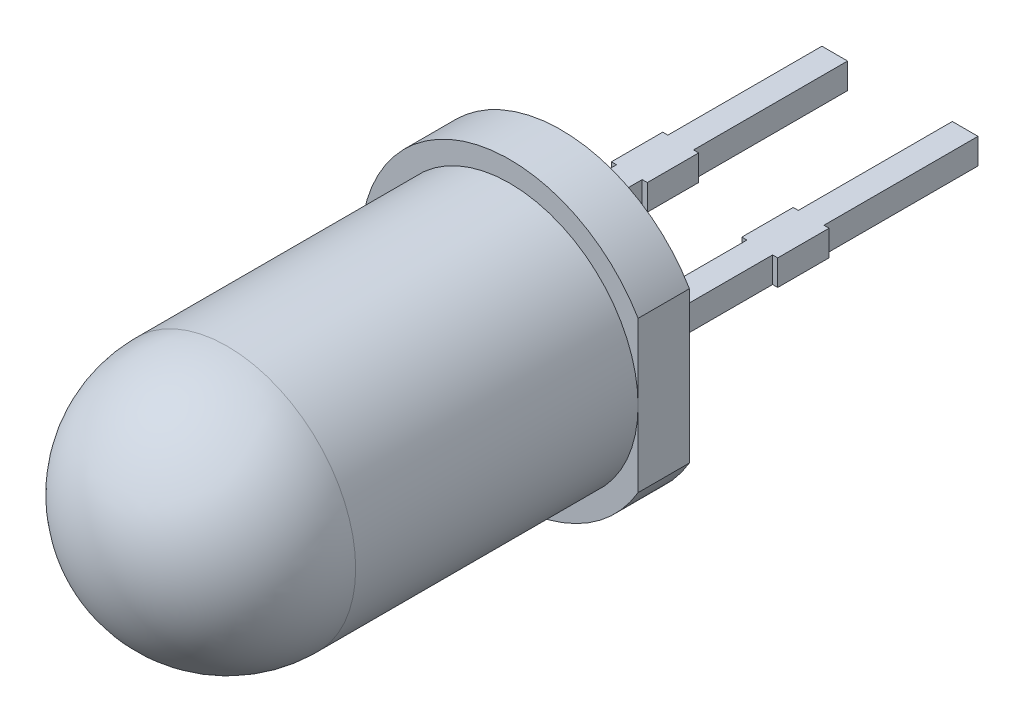
ISO-10303-21;
HEADER;
FILE_DESCRIPTION(('STEP AP214'),'2;1');
FILE_NAME('part.step','',(''),(''),'','','');
FILE_SCHEMA(('AUTOMOTIVE_DESIGN { 1 0 10303 214 1 1 1 1 }'));
ENDSEC;
DATA;
#1=APPLICATION_CONTEXT('core data for automotive mechanical design processes');
#2=APPLICATION_PROTOCOL_DEFINITION('international standard','automotive_design',2000,#1);
#3=PRODUCT_CONTEXT('',#1,'mechanical');
#4=PRODUCT('Part','Part','',(#3));
#5=PRODUCT_RELATED_PRODUCT_CATEGORY('part','',(#4));
#6=PRODUCT_DEFINITION_FORMATION('','',#4);
#7=PRODUCT_DEFINITION_CONTEXT('part definition',#1,'design');
#8=PRODUCT_DEFINITION('design','',#6,#7);
#9=PRODUCT_DEFINITION_SHAPE('','',#8);
#10=(LENGTH_UNIT() NAMED_UNIT(*) SI_UNIT(.MILLI.,.METRE.));
#11=(NAMED_UNIT(*) PLANE_ANGLE_UNIT() SI_UNIT($,.RADIAN.));
#12=(NAMED_UNIT(*) SI_UNIT($,.STERADIAN.) SOLID_ANGLE_UNIT());
#13=UNCERTAINTY_MEASURE_WITH_UNIT(LENGTH_MEASURE(1.E-05),#10,'distance_accuracy_value','');
#14=(GEOMETRIC_REPRESENTATION_CONTEXT(3) GLOBAL_UNCERTAINTY_ASSIGNED_CONTEXT((#13)) GLOBAL_UNIT_ASSIGNED_CONTEXT((#10,
#11,#12)) REPRESENTATION_CONTEXT('',''));
#15=CARTESIAN_POINT('',(0.,0.,0.));
#16=DIRECTION('',(0.,0.,1.));
#17=DIRECTION('',(1.,0.,0.));
#18=AXIS2_PLACEMENT_3D('',#15,#16,#17);
#19=CARTESIAN_POINT('',(-1.52,-0.25,3.6));
#20=DIRECTION('',(1.,0.,0.));
#21=DIRECTION('',(0.,0.,-1.));
#22=AXIS2_PLACEMENT_3D('',#19,#20,#21);
#23=PLANE('',#22);
#24=DIRECTION('',(0.,0.,-1.));
#25=VECTOR('',#24,1.);
#26=CARTESIAN_POINT('',(-1.52,0.25,3.6));
#27=LINE('',#26,#25);
#28=CARTESIAN_POINT('',(-1.52,0.25,3.6));
#29=VERTEX_POINT('',#28);
#30=CARTESIAN_POINT('',(-1.52,0.25,0.999999999999999));
#31=VERTEX_POINT('',#30);
#32=EDGE_CURVE('E241',#29,#31,#27,.T.);
#33=ORIENTED_EDGE('',*,*,#32,.T.);
#34=DIRECTION('',(0.,1.,0.));
#35=VECTOR('',#34,1.);
#36=CARTESIAN_POINT('',(-1.52,-0.25,0.999999999999999));
#37=LINE('',#36,#35);
#38=CARTESIAN_POINT('',(-1.52,-0.25,0.999999999999999));
#39=VERTEX_POINT('',#38);
#40=EDGE_CURVE('E46',#39,#31,#37,.T.);
#41=ORIENTED_EDGE('',*,*,#40,.F.);
#42=DIRECTION('',(0.,0.,-1.));
#43=VECTOR('',#42,1.);
#44=CARTESIAN_POINT('',(-1.52,-0.25,3.6));
#45=LINE('',#44,#43);
#46=CARTESIAN_POINT('',(-1.52,-0.25,3.6));
#47=VERTEX_POINT('',#46);
#48=EDGE_CURVE('E252',#47,#39,#45,.T.);
#49=ORIENTED_EDGE('',*,*,#48,.F.);
#50=DIRECTION('',(0.,1.,0.));
#51=VECTOR('',#50,1.);
#52=CARTESIAN_POINT('',(-1.52,-0.25,3.6));
#53=LINE('',#52,#51);
#54=EDGE_CURVE('E11',#47,#29,#53,.T.);
#55=ORIENTED_EDGE('',*,*,#54,.T.);
#56=EDGE_LOOP('',(#33,#41,#49,#55));
#57=FACE_BOUND('',#56,.T.);
#58=ADVANCED_FACE('F38',(#57),#23,.F.);
#59=CARTESIAN_POINT('',(-1.52,-0.25,0.999999999999999));
#60=DIRECTION('',(0.,0.,-1.));
#61=DIRECTION('',(-1.,0.,0.));
#62=AXIS2_PLACEMENT_3D('',#59,#60,#61);
#63=PLANE('',#62);
#64=DIRECTION('',(-1.,0.,0.));
#65=VECTOR('',#64,1.);
#66=CARTESIAN_POINT('',(-1.52,0.25,0.999999999999999));
#67=LINE('',#66,#65);
#68=CARTESIAN_POINT('',(-1.62,0.25,0.999999999999999));
#69=VERTEX_POINT('',#68);
#70=EDGE_CURVE('E289',#31,#69,#67,.T.);
#71=ORIENTED_EDGE('',*,*,#70,.T.);
#72=DIRECTION('',(0.,1.,0.));
#73=VECTOR('',#72,1.);
#74=CARTESIAN_POINT('',(-1.62,-0.25,0.999999999999999));
#75=LINE('',#74,#73);
#76=CARTESIAN_POINT('',(-1.62,-0.25,0.999999999999999));
#77=VERTEX_POINT('',#76);
#78=EDGE_CURVE('E353',#77,#69,#75,.T.);
#79=ORIENTED_EDGE('',*,*,#78,.F.);
#80=DIRECTION('',(-1.,0.,0.));
#81=VECTOR('',#80,1.);
#82=CARTESIAN_POINT('',(-1.52,-0.25,0.999999999999999));
#83=LINE('',#82,#81);
#84=EDGE_CURVE('E256',#39,#77,#83,.T.);
#85=ORIENTED_EDGE('',*,*,#84,.F.);
#86=ORIENTED_EDGE('',*,*,#40,.T.);
#87=EDGE_LOOP('',(#71,#79,#85,#86));
#88=FACE_BOUND('',#87,.T.);
#89=ADVANCED_FACE('F362',(#88),#63,.F.);
#90=CARTESIAN_POINT('',(-1.62,-0.25,0.999999999999999));
#91=DIRECTION('',(1.,0.,0.));
#92=DIRECTION('',(0.,0.,-1.));
#93=AXIS2_PLACEMENT_3D('',#90,#91,#92);
#94=PLANE('',#93);
#95=DIRECTION('',(0.,0.,-1.));
#96=VECTOR('',#95,1.);
#97=CARTESIAN_POINT('',(-1.62,0.25,0.999999999999999));
#98=LINE('',#97,#96);
#99=CARTESIAN_POINT('',(-1.62,0.25,0.));
#100=VERTEX_POINT('',#99);
#101=EDGE_CURVE('E292',#69,#100,#98,.T.);
#102=ORIENTED_EDGE('',*,*,#101,.T.);
#103=DIRECTION('',(0.,1.,0.));
#104=VECTOR('',#103,1.);
#105=CARTESIAN_POINT('',(-1.62,-0.25,0.));
#106=LINE('',#105,#104);
#107=CARTESIAN_POINT('',(-1.62,-0.25,0.));
#108=VERTEX_POINT('',#107);
#109=EDGE_CURVE('E349',#108,#100,#106,.T.);
#110=ORIENTED_EDGE('',*,*,#109,.F.);
#111=DIRECTION('',(0.,0.,-1.));
#112=VECTOR('',#111,1.);
#113=CARTESIAN_POINT('',(-1.62,-0.25,0.999999999999999));
#114=LINE('',#113,#112);
#115=EDGE_CURVE('E259',#77,#108,#114,.T.);
#116=ORIENTED_EDGE('',*,*,#115,.F.);
#117=ORIENTED_EDGE('',*,*,#78,.T.);
#118=EDGE_LOOP('',(#102,#110,#116,#117));
#119=FACE_BOUND('',#118,.T.);
#120=ADVANCED_FACE('F372',(#119),#94,.F.);
#121=CARTESIAN_POINT('',(-1.62,-0.25,0.));
#122=DIRECTION('',(0.,0.,1.));
#123=DIRECTION('',(1.,0.,0.));
#124=AXIS2_PLACEMENT_3D('',#121,#122,#123);
#125=PLANE('',#124);
#126=DIRECTION('',(1.,0.,0.));
#127=VECTOR('',#126,1.);
#128=CARTESIAN_POINT('',(-1.62,0.25,0.));
#129=LINE('',#128,#127);
#130=CARTESIAN_POINT('',(-1.52,0.25,0.));
#131=VERTEX_POINT('',#130);
#132=EDGE_CURVE('E295',#100,#131,#129,.T.);
#133=ORIENTED_EDGE('',*,*,#132,.T.);
#134=DIRECTION('',(0.,1.,0.));
#135=VECTOR('',#134,1.);
#136=CARTESIAN_POINT('',(-1.52,-0.25,0.));
#137=LINE('',#136,#135);
#138=CARTESIAN_POINT('',(-1.52,-0.25,0.));
#139=VERTEX_POINT('',#138);
#140=EDGE_CURVE('E345',#139,#131,#137,.T.);
#141=ORIENTED_EDGE('',*,*,#140,.F.);
#142=DIRECTION('',(1.,0.,0.));
#143=VECTOR('',#142,1.);
#144=CARTESIAN_POINT('',(-1.62,-0.25,0.));
#145=LINE('',#144,#143);
#146=EDGE_CURVE('E262',#108,#139,#145,.T.);
#147=ORIENTED_EDGE('',*,*,#146,.F.);
#148=ORIENTED_EDGE('',*,*,#109,.T.);
#149=EDGE_LOOP('',(#133,#141,#147,#148));
#150=FACE_BOUND('',#149,.T.);
#151=ADVANCED_FACE('F376',(#150),#125,.F.);
#152=CARTESIAN_POINT('',(-1.52,-0.25,0.));
#153=DIRECTION('',(1.,0.,0.));
#154=DIRECTION('',(0.,0.,-1.));
#155=AXIS2_PLACEMENT_3D('',#152,#153,#154);
#156=PLANE('',#155);
#157=DIRECTION('',(0.,0.,-1.));
#158=VECTOR('',#157,1.);
#159=CARTESIAN_POINT('',(-1.52,0.25,0.));
#160=LINE('',#159,#158);
#161=CARTESIAN_POINT('',(-1.52,0.25,-3.));
#162=VERTEX_POINT('',#161);
#163=EDGE_CURVE('E298',#131,#162,#160,.T.);
#164=ORIENTED_EDGE('',*,*,#163,.T.);
#165=DIRECTION('',(0.,1.,0.));
#166=VECTOR('',#165,1.);
#167=CARTESIAN_POINT('',(-1.52,-0.25,-3.));
#168=LINE('',#167,#166);
#169=CARTESIAN_POINT('',(-1.52,-0.25,-3.));
#170=VERTEX_POINT('',#169);
#171=EDGE_CURVE('E341',#170,#162,#168,.T.);
#172=ORIENTED_EDGE('',*,*,#171,.F.);
#173=DIRECTION('',(0.,0.,-1.));
#174=VECTOR('',#173,1.);
#175=CARTESIAN_POINT('',(-1.52,-0.25,0.));
#176=LINE('',#175,#174);
#177=EDGE_CURVE('E265',#139,#170,#176,.T.);
#178=ORIENTED_EDGE('',*,*,#177,.F.);
#179=ORIENTED_EDGE('',*,*,#140,.T.);
#180=EDGE_LOOP('',(#164,#172,#178,#179));
#181=FACE_BOUND('',#180,.T.);
#182=ADVANCED_FACE('F416',(#181),#156,.F.);
#183=CARTESIAN_POINT('',(-1.52,-0.25,-3.));
#184=DIRECTION('',(0.,0.,1.));
#185=DIRECTION('',(1.,0.,0.));
#186=AXIS2_PLACEMENT_3D('',#183,#184,#185);
#187=PLANE('',#186);
#188=DIRECTION('',(1.,0.,0.));
#189=VECTOR('',#188,1.);
#190=CARTESIAN_POINT('',(-1.52,0.25,-3.));
#191=LINE('',#190,#189);
#192=CARTESIAN_POINT('',(-1.02,0.25,-3.));
#193=VERTEX_POINT('',#192);
#194=EDGE_CURVE('E301',#162,#193,#191,.T.);
#195=ORIENTED_EDGE('',*,*,#194,.T.);
#196=DIRECTION('',(0.,1.,0.));
#197=VECTOR('',#196,1.);
#198=CARTESIAN_POINT('',(-1.02,-0.25,-3.));
#199=LINE('',#198,#197);
#200=CARTESIAN_POINT('',(-1.02,-0.25,-3.));
#201=VERTEX_POINT('',#200);
#202=EDGE_CURVE('E337',#201,#193,#199,.T.);
#203=ORIENTED_EDGE('',*,*,#202,.F.);
#204=DIRECTION('',(1.,0.,0.));
#205=VECTOR('',#204,1.);
#206=CARTESIAN_POINT('',(-1.52,-0.25,-3.));
#207=LINE('',#206,#205);
#208=EDGE_CURVE('E268',#170,#201,#207,.T.);
#209=ORIENTED_EDGE('',*,*,#208,.F.);
#210=ORIENTED_EDGE('',*,*,#171,.T.);
#211=EDGE_LOOP('',(#195,#203,#209,#210));
#212=FACE_BOUND('',#211,.T.);
#213=ADVANCED_FACE('F413',(#212),#187,.F.);
#214=CARTESIAN_POINT('',(-1.02,-0.25,0.));
#215=DIRECTION('',(-1.,0.,0.));
#216=DIRECTION('',(0.,0.,1.));
#217=AXIS2_PLACEMENT_3D('',#214,#215,#216);
#218=PLANE('',#217);
#219=DIRECTION('',(0.,0.,1.));
#220=VECTOR('',#219,1.);
#221=CARTESIAN_POINT('',(-1.02,0.25,0.));
#222=LINE('',#221,#220);
#223=CARTESIAN_POINT('',(-1.02,0.25,0.));
#224=VERTEX_POINT('',#223);
#225=EDGE_CURVE('E304',#193,#224,#222,.T.);
#226=ORIENTED_EDGE('',*,*,#225,.T.);
#227=DIRECTION('',(0.,1.,0.));
#228=VECTOR('',#227,1.);
#229=CARTESIAN_POINT('',(-1.02,-0.25,0.));
#230=LINE('',#229,#228);
#231=CARTESIAN_POINT('',(-1.02,-0.25,0.));
#232=VERTEX_POINT('',#231);
#233=EDGE_CURVE('E333',#232,#224,#230,.T.);
#234=ORIENTED_EDGE('',*,*,#233,.F.);
#235=DIRECTION('',(0.,0.,1.));
#236=VECTOR('',#235,1.);
#237=CARTESIAN_POINT('',(-1.02,-0.25,0.));
#238=LINE('',#237,#236);
#239=EDGE_CURVE('E271',#201,#232,#238,.T.);
#240=ORIENTED_EDGE('',*,*,#239,.F.);
#241=ORIENTED_EDGE('',*,*,#202,.T.);
#242=EDGE_LOOP('',(#226,#234,#240,#241));
#243=FACE_BOUND('',#242,.T.);
#244=ADVANCED_FACE('F409',(#243),#218,.F.);
#245=CARTESIAN_POINT('',(-0.92,-0.25,0.));
#246=DIRECTION('',(0.,0.,1.));
#247=DIRECTION('',(1.,0.,0.));
#248=AXIS2_PLACEMENT_3D('',#245,#246,#247);
#249=PLANE('',#248);
#250=DIRECTION('',(1.,0.,0.));
#251=VECTOR('',#250,1.);
#252=CARTESIAN_POINT('',(-0.92,0.25,0.));
#253=LINE('',#252,#251);
#254=CARTESIAN_POINT('',(-0.92,0.25,0.));
#255=VERTEX_POINT('',#254);
#256=EDGE_CURVE('E307',#224,#255,#253,.T.);
#257=ORIENTED_EDGE('',*,*,#256,.T.);
#258=DIRECTION('',(0.,1.,0.));
#259=VECTOR('',#258,1.);
#260=CARTESIAN_POINT('',(-0.92,-0.25,0.));
#261=LINE('',#260,#259);
#262=CARTESIAN_POINT('',(-0.92,-0.25,0.));
#263=VERTEX_POINT('',#262);
#264=EDGE_CURVE('E329',#263,#255,#261,.T.);
#265=ORIENTED_EDGE('',*,*,#264,.F.);
#266=DIRECTION('',(1.,0.,0.));
#267=VECTOR('',#266,1.);
#268=CARTESIAN_POINT('',(-0.92,-0.25,0.));
#269=LINE('',#268,#267);
#270=EDGE_CURVE('E274',#232,#263,#269,.T.);
#271=ORIENTED_EDGE('',*,*,#270,.F.);
#272=ORIENTED_EDGE('',*,*,#233,.T.);
#273=EDGE_LOOP('',(#257,#265,#271,#272));
#274=FACE_BOUND('',#273,.T.);
#275=ADVANCED_FACE('F405',(#274),#249,.F.);
#276=CARTESIAN_POINT('',(-0.919999999999999,-0.25,0.999999999999999));
#277=DIRECTION('',(-1.,0.,0.));
#278=DIRECTION('',(0.,0.,1.));
#279=AXIS2_PLACEMENT_3D('',#276,#277,#278);
#280=PLANE('',#279);
#281=DIRECTION('',(0.,0.,1.));
#282=VECTOR('',#281,1.);
#283=CARTESIAN_POINT('',(-0.919999999999999,0.25,0.999999999999999));
#284=LINE('',#283,#282);
#285=CARTESIAN_POINT('',(-0.919999999999999,0.25,0.999999999999999));
#286=VERTEX_POINT('',#285);
#287=EDGE_CURVE('E310',#255,#286,#284,.T.);
#288=ORIENTED_EDGE('',*,*,#287,.T.);
#289=DIRECTION('',(0.,1.,0.));
#290=VECTOR('',#289,1.);
#291=CARTESIAN_POINT('',(-0.919999999999999,-0.25,0.999999999999999));
#292=LINE('',#291,#290);
#293=CARTESIAN_POINT('',(-0.919999999999999,-0.25,0.999999999999999));
#294=VERTEX_POINT('',#293);
#295=EDGE_CURVE('E325',#294,#286,#292,.T.);
#296=ORIENTED_EDGE('',*,*,#295,.F.);
#297=DIRECTION('',(0.,0.,1.));
#298=VECTOR('',#297,1.);
#299=CARTESIAN_POINT('',(-0.919999999999999,-0.25,0.999999999999999));
#300=LINE('',#299,#298);
#301=EDGE_CURVE('E277',#263,#294,#300,.T.);
#302=ORIENTED_EDGE('',*,*,#301,.F.);
#303=ORIENTED_EDGE('',*,*,#264,.T.);
#304=EDGE_LOOP('',(#288,#296,#302,#303));
#305=FACE_BOUND('',#304,.T.);
#306=ADVANCED_FACE('F400',(#305),#280,.F.);
#307=CARTESIAN_POINT('',(-1.02,-0.25,0.999999999999999));
#308=DIRECTION('',(0.,0.,-1.));
#309=DIRECTION('',(-1.,0.,0.));
#310=AXIS2_PLACEMENT_3D('',#307,#308,#309);
#311=PLANE('',#310);
#312=DIRECTION('',(-1.,0.,0.));
#313=VECTOR('',#312,1.);
#314=CARTESIAN_POINT('',(-1.02,0.25,0.999999999999999));
#315=LINE('',#314,#313);
#316=CARTESIAN_POINT('',(-1.02,0.25,0.999999999999999));
#317=VERTEX_POINT('',#316);
#318=EDGE_CURVE('E312',#286,#317,#315,.T.);
#319=ORIENTED_EDGE('',*,*,#318,.T.);
#320=DIRECTION('',(0.,1.,0.));
#321=VECTOR('',#320,1.);
#322=CARTESIAN_POINT('',(-1.02,-0.25,0.999999999999999));
#323=LINE('',#322,#321);
#324=CARTESIAN_POINT('',(-1.02,-0.25,0.999999999999999));
#325=VERTEX_POINT('',#324);
#326=EDGE_CURVE('E321',#325,#317,#323,.T.);
#327=ORIENTED_EDGE('',*,*,#326,.F.);
#328=DIRECTION('',(-1.,0.,0.));
#329=VECTOR('',#328,1.);
#330=CARTESIAN_POINT('',(-1.02,-0.25,0.999999999999999));
#331=LINE('',#330,#329);
#332=EDGE_CURVE('E280',#294,#325,#331,.T.);
#333=ORIENTED_EDGE('',*,*,#332,.F.);
#334=ORIENTED_EDGE('',*,*,#295,.T.);
#335=EDGE_LOOP('',(#319,#327,#333,#334));
#336=FACE_BOUND('',#335,.T.);
#337=ADVANCED_FACE('F394',(#336),#311,.F.);
#338=CARTESIAN_POINT('',(-1.02,-0.25,3.6));
#339=DIRECTION('',(-1.,0.,0.));
#340=DIRECTION('',(0.,0.,1.));
#341=AXIS2_PLACEMENT_3D('',#338,#339,#340);
#342=PLANE('',#341);
#343=DIRECTION('',(0.,0.,1.));
#344=VECTOR('',#343,1.);
#345=CARTESIAN_POINT('',(-1.02,0.25,3.6));
#346=LINE('',#345,#344);
#347=CARTESIAN_POINT('',(-1.02,0.25,3.6));
#348=VERTEX_POINT('',#347);
#349=EDGE_CURVE('E253',#317,#348,#346,.T.);
#350=ORIENTED_EDGE('',*,*,#349,.T.);
#351=DIRECTION('',(0.,1.,0.));
#352=VECTOR('',#351,1.);
#353=CARTESIAN_POINT('',(-1.02,-0.25,3.6));
#354=LINE('',#353,#352);
#355=CARTESIAN_POINT('',(-1.02,-0.25,3.6));
#356=VERTEX_POINT('',#355);
#357=EDGE_CURVE('E285',#356,#348,#354,.T.);
#358=ORIENTED_EDGE('',*,*,#357,.F.);
#359=DIRECTION('',(0.,0.,1.));
#360=VECTOR('',#359,1.);
#361=CARTESIAN_POINT('',(-1.02,-0.25,3.6));
#362=LINE('',#361,#360);
#363=EDGE_CURVE('E283',#325,#356,#362,.T.);
#364=ORIENTED_EDGE('',*,*,#363,.F.);
#365=ORIENTED_EDGE('',*,*,#326,.T.);
#366=EDGE_LOOP('',(#350,#358,#364,#365));
#367=FACE_BOUND('',#366,.T.);
#368=ADVANCED_FACE('F389',(#367),#342,.F.);
#369=CARTESIAN_POINT('',(0.,-0.25,0.));
#370=DIRECTION('',(0.,1.,0.));
#371=DIRECTION('',(0.,0.,1.));
#372=AXIS2_PLACEMENT_3D('',#369,#370,#371);
#373=PLANE('',#372);
#374=DIRECTION('',(-1.,0.,0.));
#375=VECTOR('',#374,1.);
#376=CARTESIAN_POINT('',(-1.52,-0.25,3.6));
#377=LINE('',#376,#375);
#378=EDGE_CURVE('E248',#356,#47,#377,.T.);
#379=ORIENTED_EDGE('',*,*,#378,.T.);
#380=ORIENTED_EDGE('',*,*,#48,.T.);
#381=ORIENTED_EDGE('',*,*,#84,.T.);
#382=ORIENTED_EDGE('',*,*,#115,.T.);
#383=ORIENTED_EDGE('',*,*,#146,.T.);
#384=ORIENTED_EDGE('',*,*,#177,.T.);
#385=ORIENTED_EDGE('',*,*,#208,.T.);
#386=ORIENTED_EDGE('',*,*,#239,.T.);
#387=ORIENTED_EDGE('',*,*,#270,.T.);
#388=ORIENTED_EDGE('',*,*,#301,.T.);
#389=ORIENTED_EDGE('',*,*,#332,.T.);
#390=ORIENTED_EDGE('',*,*,#363,.T.);
#391=EDGE_LOOP('',(#379,#380,#381,#382,#383,#384,#385,#386,#387,#388,#389,#390));
#392=FACE_BOUND('',#391,.T.);
#393=ADVANCED_FACE('F380',(#392),#373,.F.);
#394=CARTESIAN_POINT('',(0.,0.25,0.));
#395=DIRECTION('',(0.,1.,0.));
#396=DIRECTION('',(0.,0.,1.));
#397=AXIS2_PLACEMENT_3D('',#394,#395,#396);
#398=PLANE('',#397);
#399=DIRECTION('',(-1.,0.,0.));
#400=VECTOR('',#399,1.);
#401=CARTESIAN_POINT('',(-1.52,0.25,3.6));
#402=LINE('',#401,#400);
#403=EDGE_CURVE('E235',#348,#29,#402,.T.);
#404=ORIENTED_EDGE('',*,*,#403,.F.);
#405=ORIENTED_EDGE('',*,*,#349,.F.);
#406=ORIENTED_EDGE('',*,*,#318,.F.);
#407=ORIENTED_EDGE('',*,*,#287,.F.);
#408=ORIENTED_EDGE('',*,*,#256,.F.);
#409=ORIENTED_EDGE('',*,*,#225,.F.);
#410=ORIENTED_EDGE('',*,*,#194,.F.);
#411=ORIENTED_EDGE('',*,*,#163,.F.);
#412=ORIENTED_EDGE('',*,*,#132,.F.);
#413=ORIENTED_EDGE('',*,*,#101,.F.);
#414=ORIENTED_EDGE('',*,*,#70,.F.);
#415=ORIENTED_EDGE('',*,*,#32,.F.);
#416=EDGE_LOOP('',(#404,#405,#406,#407,#408,#409,#410,#411,#412,#413,#414,#415));
#417=FACE_BOUND('',#416,.T.);
#418=ADVANCED_FACE('F367',(#417),#398,.T.);
#419=CARTESIAN_POINT('',(2.9,0.,3.6));
#420=DIRECTION('',(0.,0.,-1.));
#421=DIRECTION('',(-1.,0.,0.));
#422=AXIS2_PLACEMENT_3D('',#419,#420,#421);
#423=PLANE('',#422);
#424=DIRECTION('',(0.,-1.,0.));
#425=VECTOR('',#424,1.);
#426=CARTESIAN_POINT('',(2.5,1.4696938456699,3.6));
#427=LINE('',#426,#425);
#428=CARTESIAN_POINT('',(2.5,1.4696938456699,3.6));
#429=VERTEX_POINT('',#428);
#430=CARTESIAN_POINT('',(2.5,-1.4696938456699,3.6));
#431=VERTEX_POINT('',#430);
#432=EDGE_CURVE('E212',#429,#431,#427,.T.);
#433=ORIENTED_EDGE('',*,*,#432,.T.);
#434=CARTESIAN_POINT('',(0.,0.,3.6));
#435=DIRECTION('',(0.,0.,1.));
#436=DIRECTION('',(1.,0.,0.));
#437=AXIS2_PLACEMENT_3D('',#434,#435,#436);
#438=CIRCLE('',#437,2.9);
#439=EDGE_CURVE('E227',#429,#431,#438,.T.);
#440=ORIENTED_EDGE('',*,*,#439,.F.);
#441=EDGE_LOOP('',(#433,#440));
#442=FACE_BOUND('',#441,.T.);
#443=DIRECTION('',(-1.,0.,0.));
#444=VECTOR('',#443,1.);
#445=CARTESIAN_POINT('',(1.02,-0.25,3.6));
#446=LINE('',#445,#444);
#447=CARTESIAN_POINT('',(1.52,-0.25,3.6));
#448=VERTEX_POINT('',#447);
#449=CARTESIAN_POINT('',(1.02,-0.25,3.6));
#450=VERTEX_POINT('',#449);
#451=EDGE_CURVE('E841',#448,#450,#446,.T.);
#452=ORIENTED_EDGE('',*,*,#451,.F.);
#453=DIRECTION('',(0.,1.,0.));
#454=VECTOR('',#453,1.);
#455=CARTESIAN_POINT('',(1.52,-0.25,3.6));
#456=LINE('',#455,#454);
#457=CARTESIAN_POINT('',(1.52,0.25,3.6));
#458=VERTEX_POINT('',#457);
#459=EDGE_CURVE('E822',#448,#458,#456,.T.);
#460=ORIENTED_EDGE('',*,*,#459,.T.);
#461=DIRECTION('',(-1.,0.,0.));
#462=VECTOR('',#461,1.);
#463=CARTESIAN_POINT('',(1.02,0.25,3.6));
#464=LINE('',#463,#462);
#465=CARTESIAN_POINT('',(1.02,0.25,3.6));
#466=VERTEX_POINT('',#465);
#467=EDGE_CURVE('E740',#458,#466,#464,.T.);
#468=ORIENTED_EDGE('',*,*,#467,.T.);
#469=DIRECTION('',(0.,1.,0.));
#470=VECTOR('',#469,1.);
#471=CARTESIAN_POINT('',(1.02,-0.25,3.6));
#472=LINE('',#471,#470);
#473=EDGE_CURVE('E819',#450,#466,#472,.T.);
#474=ORIENTED_EDGE('',*,*,#473,.F.);
#475=EDGE_LOOP('',(#452,#460,#468,#474));
#476=FACE_BOUND('',#475,.T.);
#477=ORIENTED_EDGE('',*,*,#357,.T.);
#478=ORIENTED_EDGE('',*,*,#403,.T.);
#479=ORIENTED_EDGE('',*,*,#54,.F.);
#480=ORIENTED_EDGE('',*,*,#378,.F.);
#481=EDGE_LOOP('',(#477,#478,#479,#480));
#482=FACE_BOUND('',#481,.T.);
#483=ADVANCED_FACE('F232',(#442,#476,#482),#423,.T.);
#484=CARTESIAN_POINT('',(0.,0.,3.6));
#485=DIRECTION('',(0.,0.,1.));
#486=DIRECTION('',(1.,0.,0.));
#487=AXIS2_PLACEMENT_3D('',#484,#485,#486);
#488=CYLINDRICAL_SURFACE('',#487,2.9);
#489=DIRECTION('',(0.,0.,1.));
#490=VECTOR('',#489,1.);
#491=CARTESIAN_POINT('',(2.5,-1.4696938456699,-3.001));
#492=LINE('',#491,#490);
#493=CARTESIAN_POINT('',(2.5,-1.4696938456699,4.6));
#494=VERTEX_POINT('',#493);
#495=EDGE_CURVE('E217',#431,#494,#492,.T.);
#496=ORIENTED_EDGE('',*,*,#495,.T.);
#497=CARTESIAN_POINT('',(0.,0.,4.6));
#498=DIRECTION('',(0.,0.,1.));
#499=DIRECTION('',(1.,0.,0.));
#500=AXIS2_PLACEMENT_3D('',#497,#498,#499);
#501=CIRCLE('',#500,2.9);
#502=CARTESIAN_POINT('',(2.5,1.4696938456699,4.6));
#503=VERTEX_POINT('',#502);
#504=EDGE_CURVE('E229',#503,#494,#501,.T.);
#505=ORIENTED_EDGE('',*,*,#504,.F.);
#506=DIRECTION('',(0.,0.,1.));
#507=VECTOR('',#506,1.);
#508=CARTESIAN_POINT('',(2.5,1.4696938456699,-3.001));
#509=LINE('',#508,#507);
#510=EDGE_CURVE('E215',#429,#503,#509,.T.);
#511=ORIENTED_EDGE('',*,*,#510,.F.);
#512=ORIENTED_EDGE('',*,*,#439,.T.);
#513=EDGE_LOOP('',(#496,#505,#511,#512));
#514=FACE_BOUND('',#513,.T.);
#515=ADVANCED_FACE('F226',(#514),#488,.T.);
#516=CARTESIAN_POINT('',(2.5,0.,4.6));
#517=DIRECTION('',(0.,0.,1.));
#518=DIRECTION('',(1.,0.,0.));
#519=AXIS2_PLACEMENT_3D('',#516,#517,#518);
#520=PLANE('',#519);
#521=DIRECTION('',(0.,-1.,0.));
#522=VECTOR('',#521,1.);
#523=CARTESIAN_POINT('',(2.5,1.4696938456699,4.6));
#524=LINE('',#523,#522);
#525=CARTESIAN_POINT('',(2.5,0.,4.6));
#526=VERTEX_POINT('',#525);
#527=EDGE_CURVE('E53',#503,#526,#524,.T.);
#528=ORIENTED_EDGE('',*,*,#527,.F.);
#529=ORIENTED_EDGE('',*,*,#504,.T.);
#530=EDGE_CURVE('E832',#526,#494,#524,.T.);
#531=ORIENTED_EDGE('',*,*,#530,.F.);
#532=CARTESIAN_POINT('',(0.,0.,4.6));
#533=DIRECTION('',(0.,0.,1.));
#534=DIRECTION('',(1.,0.,0.));
#535=AXIS2_PLACEMENT_3D('',#532,#533,#534);
#536=CIRCLE('',#535,2.5);
#537=EDGE_CURVE('E244',#526,#526,#536,.T.);
#538=ORIENTED_EDGE('',*,*,#537,.F.);
#539=EDGE_LOOP('',(#528,#529,#531,#538));
#540=FACE_BOUND('',#539,.T.);
#541=ADVANCED_FACE('F512',(#540),#520,.T.);
#542=CARTESIAN_POINT('',(0.,0.,3.6));
#543=DIRECTION('',(0.,0.,1.));
#544=DIRECTION('',(1.,0.,0.));
#545=AXIS2_PLACEMENT_3D('',#542,#543,#544);
#546=CYLINDRICAL_SURFACE('',#545,2.5);
#547=ORIENTED_EDGE('',*,*,#537,.T.);
#548=EDGE_LOOP('',(#547));
#549=FACE_BOUND('',#548,.T.);
#550=CARTESIAN_POINT('',(0.,0.,10.1));
#551=DIRECTION('',(0.,0.,1.));
#552=DIRECTION('',(1.,0.,0.));
#553=AXIS2_PLACEMENT_3D('',#550,#551,#552);
#554=CIRCLE('',#553,2.5);
#555=CARTESIAN_POINT('',(2.5,0.,10.1));
#556=VERTEX_POINT('',#555);
#557=EDGE_CURVE('E825',#556,#556,#554,.T.);
#558=ORIENTED_EDGE('',*,*,#557,.F.);
#559=EDGE_LOOP('',(#558));
#560=FACE_BOUND('',#559,.T.);
#561=ADVANCED_FACE('F520',(#549,#560),#546,.T.);
#562=CARTESIAN_POINT('',(0.,0.,10.1));
#563=DIRECTION('',(0.,0.,1.));
#564=DIRECTION('',(1.,0.,0.));
#565=AXIS2_PLACEMENT_3D('',#562,#563,#564);
#566=SPHERICAL_SURFACE('',#565,2.5);
#567=ORIENTED_EDGE('',*,*,#557,.T.);
#568=EDGE_LOOP('',(#567));
#569=FACE_BOUND('',#568,.T.);
#570=ADVANCED_FACE('F529',(#569),#566,.T.);
#571=CARTESIAN_POINT('',(1.52,-0.25,3.6));
#572=DIRECTION('',(-1.,0.,0.));
#573=DIRECTION('',(0.,0.,1.));
#574=AXIS2_PLACEMENT_3D('',#571,#572,#573);
#575=PLANE('',#574);
#576=DIRECTION('',(0.,0.,1.));
#577=VECTOR('',#576,1.);
#578=CARTESIAN_POINT('',(1.52,0.25,3.6));
#579=LINE('',#578,#577);
#580=CARTESIAN_POINT('',(1.52,0.25,0.999999999999999));
#581=VERTEX_POINT('',#580);
#582=EDGE_CURVE('E222',#581,#458,#579,.T.);
#583=ORIENTED_EDGE('',*,*,#582,.T.);
#584=ORIENTED_EDGE('',*,*,#459,.F.);
#585=DIRECTION('',(0.,0.,1.));
#586=VECTOR('',#585,1.);
#587=CARTESIAN_POINT('',(1.52,-0.25,3.6));
#588=LINE('',#587,#586);
#589=CARTESIAN_POINT('',(1.52,-0.25,0.999999999999999));
#590=VERTEX_POINT('',#589);
#591=EDGE_CURVE('E780',#590,#448,#588,.T.);
#592=ORIENTED_EDGE('',*,*,#591,.F.);
#593=DIRECTION('',(0.,1.,0.));
#594=VECTOR('',#593,1.);
#595=CARTESIAN_POINT('',(1.52,-0.25,0.999999999999999));
#596=LINE('',#595,#594);
#597=EDGE_CURVE('E781',#590,#581,#596,.T.);
#598=ORIENTED_EDGE('',*,*,#597,.T.);
#599=EDGE_LOOP('',(#583,#584,#592,#598));
#600=FACE_BOUND('',#599,.T.);
#601=ADVANCED_FACE('F538',(#600),#575,.F.);
#602=CARTESIAN_POINT('',(1.02,-0.25,3.6));
#603=DIRECTION('',(1.,0.,0.));
#604=DIRECTION('',(0.,0.,-1.));
#605=AXIS2_PLACEMENT_3D('',#602,#603,#604);
#606=PLANE('',#605);
#607=DIRECTION('',(0.,0.,-1.));
#608=VECTOR('',#607,1.);
#609=CARTESIAN_POINT('',(1.02,0.25,3.6));
#610=LINE('',#609,#608);
#611=CARTESIAN_POINT('',(1.02,0.25,0.999999999999999));
#612=VERTEX_POINT('',#611);
#613=EDGE_CURVE('E61',#466,#612,#610,.T.);
#614=ORIENTED_EDGE('',*,*,#613,.T.);
#615=DIRECTION('',(0.,1.,0.));
#616=VECTOR('',#615,1.);
#617=CARTESIAN_POINT('',(1.02,-0.25,0.999999999999999));
#618=LINE('',#617,#616);
#619=CARTESIAN_POINT('',(1.02,-0.25,0.999999999999999));
#620=VERTEX_POINT('',#619);
#621=EDGE_CURVE('E815',#620,#612,#618,.T.);
#622=ORIENTED_EDGE('',*,*,#621,.F.);
#623=DIRECTION('',(0.,0.,-1.));
#624=VECTOR('',#623,1.);
#625=CARTESIAN_POINT('',(1.02,-0.25,3.6));
#626=LINE('',#625,#624);
#627=EDGE_CURVE('E844',#450,#620,#626,.T.);
#628=ORIENTED_EDGE('',*,*,#627,.F.);
#629=ORIENTED_EDGE('',*,*,#473,.T.);
#630=EDGE_LOOP('',(#614,#622,#628,#629));
#631=FACE_BOUND('',#630,.T.);
#632=ADVANCED_FACE('F547',(#631),#606,.F.);
#633=CARTESIAN_POINT('',(1.02,-0.25,0.999999999999999));
#634=DIRECTION('',(0.,0.,-1.));
#635=DIRECTION('',(-1.,0.,0.));
#636=AXIS2_PLACEMENT_3D('',#633,#634,#635);
#637=PLANE('',#636);
#638=DIRECTION('',(-1.,0.,0.));
#639=VECTOR('',#638,1.);
#640=CARTESIAN_POINT('',(1.02,0.25,0.999999999999999));
#641=LINE('',#640,#639);
#642=CARTESIAN_POINT('',(0.919999999999999,0.25,0.999999999999999));
#643=VERTEX_POINT('',#642);
#644=EDGE_CURVE('E754',#612,#643,#641,.T.);
#645=ORIENTED_EDGE('',*,*,#644,.T.);
#646=DIRECTION('',(0.,1.,0.));
#647=VECTOR('',#646,1.);
#648=CARTESIAN_POINT('',(0.919999999999999,-0.25,0.999999999999999));
#649=LINE('',#648,#647);
#650=CARTESIAN_POINT('',(0.919999999999999,-0.25,0.999999999999999));
#651=VERTEX_POINT('',#650);
#652=EDGE_CURVE('E811',#651,#643,#649,.T.);
#653=ORIENTED_EDGE('',*,*,#652,.F.);
#654=DIRECTION('',(-1.,0.,0.));
#655=VECTOR('',#654,1.);
#656=CARTESIAN_POINT('',(1.02,-0.25,0.999999999999999));
#657=LINE('',#656,#655);
#658=EDGE_CURVE('E847',#620,#651,#657,.T.);
#659=ORIENTED_EDGE('',*,*,#658,.F.);
#660=ORIENTED_EDGE('',*,*,#621,.T.);
#661=EDGE_LOOP('',(#645,#653,#659,#660));
#662=FACE_BOUND('',#661,.T.);
#663=ADVANCED_FACE('F556',(#662),#637,.F.);
#664=CARTESIAN_POINT('',(0.919999999999999,-0.25,0.999999999999999));
#665=DIRECTION('',(1.,0.,0.));
#666=DIRECTION('',(0.,0.,-1.));
#667=AXIS2_PLACEMENT_3D('',#664,#665,#666);
#668=PLANE('',#667);
#669=DIRECTION('',(0.,0.,-1.));
#670=VECTOR('',#669,1.);
#671=CARTESIAN_POINT('',(0.919999999999999,0.25,0.999999999999999));
#672=LINE('',#671,#670);
#673=CARTESIAN_POINT('',(0.92,0.25,0.));
#674=VERTEX_POINT('',#673);
#675=EDGE_CURVE('E757',#643,#674,#672,.T.);
#676=ORIENTED_EDGE('',*,*,#675,.T.);
#677=DIRECTION('',(0.,1.,0.));
#678=VECTOR('',#677,1.);
#679=CARTESIAN_POINT('',(0.92,-0.25,0.));
#680=LINE('',#679,#678);
#681=CARTESIAN_POINT('',(0.92,-0.25,0.));
#682=VERTEX_POINT('',#681);
#683=EDGE_CURVE('E807',#682,#674,#680,.T.);
#684=ORIENTED_EDGE('',*,*,#683,.F.);
#685=DIRECTION('',(0.,0.,-1.));
#686=VECTOR('',#685,1.);
#687=CARTESIAN_POINT('',(0.919999999999999,-0.25,0.999999999999999));
#688=LINE('',#687,#686);
#689=EDGE_CURVE('E850',#651,#682,#688,.T.);
#690=ORIENTED_EDGE('',*,*,#689,.F.);
#691=ORIENTED_EDGE('',*,*,#652,.T.);
#692=EDGE_LOOP('',(#676,#684,#690,#691));
#693=FACE_BOUND('',#692,.T.);
#694=ADVANCED_FACE('F565',(#693),#668,.F.);
#695=CARTESIAN_POINT('',(0.92,-0.25,0.));
#696=DIRECTION('',(0.,0.,1.));
#697=DIRECTION('',(1.,0.,0.));
#698=AXIS2_PLACEMENT_3D('',#695,#696,#697);
#699=PLANE('',#698);
#700=DIRECTION('',(1.,0.,0.));
#701=VECTOR('',#700,1.);
#702=CARTESIAN_POINT('',(0.92,0.25,0.));
#703=LINE('',#702,#701);
#704=CARTESIAN_POINT('',(1.02,0.25,0.));
#705=VERTEX_POINT('',#704);
#706=EDGE_CURVE('E760',#674,#705,#703,.T.);
#707=ORIENTED_EDGE('',*,*,#706,.T.);
#708=DIRECTION('',(0.,1.,0.));
#709=VECTOR('',#708,1.);
#710=CARTESIAN_POINT('',(1.02,-0.25,0.));
#711=LINE('',#710,#709);
#712=CARTESIAN_POINT('',(1.02,-0.25,0.));
#713=VERTEX_POINT('',#712);
#714=EDGE_CURVE('E803',#713,#705,#711,.T.);
#715=ORIENTED_EDGE('',*,*,#714,.F.);
#716=DIRECTION('',(1.,0.,0.));
#717=VECTOR('',#716,1.);
#718=CARTESIAN_POINT('',(0.92,-0.25,0.));
#719=LINE('',#718,#717);
#720=EDGE_CURVE('E853',#682,#713,#719,.T.);
#721=ORIENTED_EDGE('',*,*,#720,.F.);
#722=ORIENTED_EDGE('',*,*,#683,.T.);
#723=EDGE_LOOP('',(#707,#715,#721,#722));
#724=FACE_BOUND('',#723,.T.);
#725=ADVANCED_FACE('F574',(#724),#699,.F.);
#726=CARTESIAN_POINT('',(1.02,-0.25,0.));
#727=DIRECTION('',(1.,0.,0.));
#728=DIRECTION('',(0.,0.,-1.));
#729=AXIS2_PLACEMENT_3D('',#726,#727,#728);
#730=PLANE('',#729);
#731=DIRECTION('',(0.,0.,-1.));
#732=VECTOR('',#731,1.);
#733=CARTESIAN_POINT('',(1.02,0.25,0.));
#734=LINE('',#733,#732);
#735=CARTESIAN_POINT('',(1.02,0.25,-3.));
#736=VERTEX_POINT('',#735);
#737=EDGE_CURVE('E763',#705,#736,#734,.T.);
#738=ORIENTED_EDGE('',*,*,#737,.T.);
#739=DIRECTION('',(0.,1.,0.));
#740=VECTOR('',#739,1.);
#741=CARTESIAN_POINT('',(1.02,-0.25,-3.));
#742=LINE('',#741,#740);
#743=CARTESIAN_POINT('',(1.02,-0.25,-3.));
#744=VERTEX_POINT('',#743);
#745=EDGE_CURVE('E799',#744,#736,#742,.T.);
#746=ORIENTED_EDGE('',*,*,#745,.F.);
#747=DIRECTION('',(0.,0.,-1.));
#748=VECTOR('',#747,1.);
#749=CARTESIAN_POINT('',(1.02,-0.25,0.));
#750=LINE('',#749,#748);
#751=EDGE_CURVE('E856',#713,#744,#750,.T.);
#752=ORIENTED_EDGE('',*,*,#751,.F.);
#753=ORIENTED_EDGE('',*,*,#714,.T.);
#754=EDGE_LOOP('',(#738,#746,#752,#753));
#755=FACE_BOUND('',#754,.T.);
#756=ADVANCED_FACE('F583',(#755),#730,.F.);
#757=CARTESIAN_POINT('',(1.52,-0.25,-3.));
#758=DIRECTION('',(0.,0.,1.));
#759=DIRECTION('',(1.,0.,0.));
#760=AXIS2_PLACEMENT_3D('',#757,#758,#759);
#761=PLANE('',#760);
#762=DIRECTION('',(1.,0.,0.));
#763=VECTOR('',#762,1.);
#764=CARTESIAN_POINT('',(1.52,0.25,-3.));
#765=LINE('',#764,#763);
#766=CARTESIAN_POINT('',(1.52,0.25,-3.));
#767=VERTEX_POINT('',#766);
#768=EDGE_CURVE('E766',#736,#767,#765,.T.);
#769=ORIENTED_EDGE('',*,*,#768,.T.);
#770=DIRECTION('',(0.,1.,0.));
#771=VECTOR('',#770,1.);
#772=CARTESIAN_POINT('',(1.52,-0.25,-3.));
#773=LINE('',#772,#771);
#774=CARTESIAN_POINT('',(1.52,-0.25,-3.));
#775=VERTEX_POINT('',#774);
#776=EDGE_CURVE('E795',#775,#767,#773,.T.);
#777=ORIENTED_EDGE('',*,*,#776,.F.);
#778=DIRECTION('',(1.,0.,0.));
#779=VECTOR('',#778,1.);
#780=CARTESIAN_POINT('',(1.52,-0.25,-3.));
#781=LINE('',#780,#779);
#782=EDGE_CURVE('E859',#744,#775,#781,.T.);
#783=ORIENTED_EDGE('',*,*,#782,.F.);
#784=ORIENTED_EDGE('',*,*,#745,.T.);
#785=EDGE_LOOP('',(#769,#777,#783,#784));
#786=FACE_BOUND('',#785,.T.);
#787=ADVANCED_FACE('F592',(#786),#761,.F.);
#788=CARTESIAN_POINT('',(1.52,-0.25,0.));
#789=DIRECTION('',(-1.,0.,0.));
#790=DIRECTION('',(0.,0.,1.));
#791=AXIS2_PLACEMENT_3D('',#788,#789,#790);
#792=PLANE('',#791);
#793=DIRECTION('',(0.,0.,1.));
#794=VECTOR('',#793,1.);
#795=CARTESIAN_POINT('',(1.52,0.25,0.));
#796=LINE('',#795,#794);
#797=CARTESIAN_POINT('',(1.52,0.25,0.));
#798=VERTEX_POINT('',#797);
#799=EDGE_CURVE('E769',#767,#798,#796,.T.);
#800=ORIENTED_EDGE('',*,*,#799,.T.);
#801=DIRECTION('',(0.,1.,0.));
#802=VECTOR('',#801,1.);
#803=CARTESIAN_POINT('',(1.52,-0.25,0.));
#804=LINE('',#803,#802);
#805=CARTESIAN_POINT('',(1.52,-0.25,0.));
#806=VERTEX_POINT('',#805);
#807=EDGE_CURVE('E791',#806,#798,#804,.T.);
#808=ORIENTED_EDGE('',*,*,#807,.F.);
#809=DIRECTION('',(0.,0.,1.));
#810=VECTOR('',#809,1.);
#811=CARTESIAN_POINT('',(1.52,-0.25,0.));
#812=LINE('',#811,#810);
#813=EDGE_CURVE('E862',#775,#806,#812,.T.);
#814=ORIENTED_EDGE('',*,*,#813,.F.);
#815=ORIENTED_EDGE('',*,*,#776,.T.);
#816=EDGE_LOOP('',(#800,#808,#814,#815));
#817=FACE_BOUND('',#816,.T.);
#818=ADVANCED_FACE('F601',(#817),#792,.F.);
#819=CARTESIAN_POINT('',(1.62,-0.25,0.));
#820=DIRECTION('',(0.,0.,1.));
#821=DIRECTION('',(1.,0.,0.));
#822=AXIS2_PLACEMENT_3D('',#819,#820,#821);
#823=PLANE('',#822);
#824=DIRECTION('',(1.,0.,0.));
#825=VECTOR('',#824,1.);
#826=CARTESIAN_POINT('',(1.62,0.25,0.));
#827=LINE('',#826,#825);
#828=CARTESIAN_POINT('',(1.62,0.25,0.));
#829=VERTEX_POINT('',#828);
#830=EDGE_CURVE('E772',#798,#829,#827,.T.);
#831=ORIENTED_EDGE('',*,*,#830,.T.);
#832=DIRECTION('',(0.,1.,0.));
#833=VECTOR('',#832,1.);
#834=CARTESIAN_POINT('',(1.62,-0.25,0.));
#835=LINE('',#834,#833);
#836=CARTESIAN_POINT('',(1.62,-0.25,0.));
#837=VERTEX_POINT('',#836);
#838=EDGE_CURVE('E787',#837,#829,#835,.T.);
#839=ORIENTED_EDGE('',*,*,#838,.F.);
#840=DIRECTION('',(1.,0.,0.));
#841=VECTOR('',#840,1.);
#842=CARTESIAN_POINT('',(1.62,-0.25,0.));
#843=LINE('',#842,#841);
#844=EDGE_CURVE('E865',#806,#837,#843,.T.);
#845=ORIENTED_EDGE('',*,*,#844,.F.);
#846=ORIENTED_EDGE('',*,*,#807,.T.);
#847=EDGE_LOOP('',(#831,#839,#845,#846));
#848=FACE_BOUND('',#847,.T.);
#849=ADVANCED_FACE('F610',(#848),#823,.F.);
#850=CARTESIAN_POINT('',(1.62,-0.25,0.999999999999999));
#851=DIRECTION('',(-1.,0.,0.));
#852=DIRECTION('',(0.,0.,1.));
#853=AXIS2_PLACEMENT_3D('',#850,#851,#852);
#854=PLANE('',#853);
#855=DIRECTION('',(0.,0.,1.));
#856=VECTOR('',#855,1.);
#857=CARTESIAN_POINT('',(1.62,0.25,0.999999999999999));
#858=LINE('',#857,#856);
#859=CARTESIAN_POINT('',(1.62,0.25,0.999999999999999));
#860=VERTEX_POINT('',#859);
#861=EDGE_CURVE('E775',#829,#860,#858,.T.);
#862=ORIENTED_EDGE('',*,*,#861,.T.);
#863=DIRECTION('',(0.,1.,0.));
#864=VECTOR('',#863,1.);
#865=CARTESIAN_POINT('',(1.62,-0.25,0.999999999999999));
#866=LINE('',#865,#864);
#867=CARTESIAN_POINT('',(1.62,-0.25,0.999999999999999));
#868=VERTEX_POINT('',#867);
#869=EDGE_CURVE('E783',#868,#860,#866,.T.);
#870=ORIENTED_EDGE('',*,*,#869,.F.);
#871=DIRECTION('',(0.,0.,1.));
#872=VECTOR('',#871,1.);
#873=CARTESIAN_POINT('',(1.62,-0.25,0.999999999999999));
#874=LINE('',#873,#872);
#875=EDGE_CURVE('E867',#837,#868,#874,.T.);
#876=ORIENTED_EDGE('',*,*,#875,.F.);
#877=ORIENTED_EDGE('',*,*,#838,.T.);
#878=EDGE_LOOP('',(#862,#870,#876,#877));
#879=FACE_BOUND('',#878,.T.);
#880=ADVANCED_FACE('F619',(#879),#854,.F.);
#881=CARTESIAN_POINT('',(1.52,-0.25,0.999999999999999));
#882=DIRECTION('',(0.,0.,-1.));
#883=DIRECTION('',(-1.,0.,0.));
#884=AXIS2_PLACEMENT_3D('',#881,#882,#883);
#885=PLANE('',#884);
#886=DIRECTION('',(-1.,0.,0.));
#887=VECTOR('',#886,1.);
#888=CARTESIAN_POINT('',(1.52,0.25,0.999999999999999));
#889=LINE('',#888,#887);
#890=EDGE_CURVE('E738',#860,#581,#889,.T.);
#891=ORIENTED_EDGE('',*,*,#890,.T.);
#892=ORIENTED_EDGE('',*,*,#597,.F.);
#893=DIRECTION('',(-1.,0.,0.));
#894=VECTOR('',#893,1.);
#895=CARTESIAN_POINT('',(1.52,-0.25,0.999999999999999));
#896=LINE('',#895,#894);
#897=EDGE_CURVE('E749',#868,#590,#896,.T.);
#898=ORIENTED_EDGE('',*,*,#897,.F.);
#899=ORIENTED_EDGE('',*,*,#869,.T.);
#900=EDGE_LOOP('',(#891,#892,#898,#899));
#901=FACE_BOUND('',#900,.T.);
#902=ADVANCED_FACE('F628',(#901),#885,.F.);
#903=CARTESIAN_POINT('',(0.,-0.25,0.));
#904=DIRECTION('',(0.,-1.,0.));
#905=DIRECTION('',(0.,0.,-1.));
#906=AXIS2_PLACEMENT_3D('',#903,#904,#905);
#907=PLANE('',#906);
#908=ORIENTED_EDGE('',*,*,#591,.T.);
#909=ORIENTED_EDGE('',*,*,#451,.T.);
#910=ORIENTED_EDGE('',*,*,#627,.T.);
#911=ORIENTED_EDGE('',*,*,#658,.T.);
#912=ORIENTED_EDGE('',*,*,#689,.T.);
#913=ORIENTED_EDGE('',*,*,#720,.T.);
#914=ORIENTED_EDGE('',*,*,#751,.T.);
#915=ORIENTED_EDGE('',*,*,#782,.T.);
#916=ORIENTED_EDGE('',*,*,#813,.T.);
#917=ORIENTED_EDGE('',*,*,#844,.T.);
#918=ORIENTED_EDGE('',*,*,#875,.T.);
#919=ORIENTED_EDGE('',*,*,#897,.T.);
#920=EDGE_LOOP('',(#908,#909,#910,#911,#912,#913,#914,#915,#916,#917,#918,#919));
#921=FACE_BOUND('',#920,.T.);
#922=ADVANCED_FACE('F637',(#921),#907,.T.);
#923=CARTESIAN_POINT('',(0.,0.25,0.));
#924=DIRECTION('',(0.,-1.,0.));
#925=DIRECTION('',(0.,0.,-1.));
#926=AXIS2_PLACEMENT_3D('',#923,#924,#925);
#927=PLANE('',#926);
#928=ORIENTED_EDGE('',*,*,#582,.F.);
#929=ORIENTED_EDGE('',*,*,#890,.F.);
#930=ORIENTED_EDGE('',*,*,#861,.F.);
#931=ORIENTED_EDGE('',*,*,#830,.F.);
#932=ORIENTED_EDGE('',*,*,#799,.F.);
#933=ORIENTED_EDGE('',*,*,#768,.F.);
#934=ORIENTED_EDGE('',*,*,#737,.F.);
#935=ORIENTED_EDGE('',*,*,#706,.F.);
#936=ORIENTED_EDGE('',*,*,#675,.F.);
#937=ORIENTED_EDGE('',*,*,#644,.F.);
#938=ORIENTED_EDGE('',*,*,#613,.F.);
#939=ORIENTED_EDGE('',*,*,#467,.F.);
#940=EDGE_LOOP('',(#928,#929,#930,#931,#932,#933,#934,#935,#936,#937,#938,#939));
#941=FACE_BOUND('',#940,.T.);
#942=ADVANCED_FACE('F646',(#941),#927,.F.);
#943=CARTESIAN_POINT('',(2.5,1.4696938456699,-3.001));
#944=DIRECTION('',(-1.,0.,0.));
#945=DIRECTION('',(0.,0.,1.));
#946=AXIS2_PLACEMENT_3D('',#943,#944,#945);
#947=PLANE('',#946);
#948=ORIENTED_EDGE('',*,*,#510,.T.);
#949=ORIENTED_EDGE('',*,*,#527,.T.);
#950=ORIENTED_EDGE('',*,*,#530,.T.);
#951=ORIENTED_EDGE('',*,*,#495,.F.);
#952=ORIENTED_EDGE('',*,*,#432,.F.);
#953=EDGE_LOOP('',(#948,#949,#950,#951,#952));
#954=FACE_BOUND('',#953,.T.);
#955=ADVANCED_FACE('F214',(#954),#947,.F.);
#956=CLOSED_SHELL('',(#58,#89,#120,#151,#182,#213,#244,#275,#306,#337,#368,#393,#418,#483,#515,
#541,#561,#570,#601,#632,#663,#694,#725,#756,#787,#818,#849,#880,#902,#922,#942,#955));
#957=MANIFOLD_SOLID_BREP('B2',#956);
#958=ADVANCED_BREP_SHAPE_REPRESENTATION('',(#18,#957),#14);
#959=SHAPE_DEFINITION_REPRESENTATION(#9,#958);
ENDSEC;
END-ISO-10303-21;
